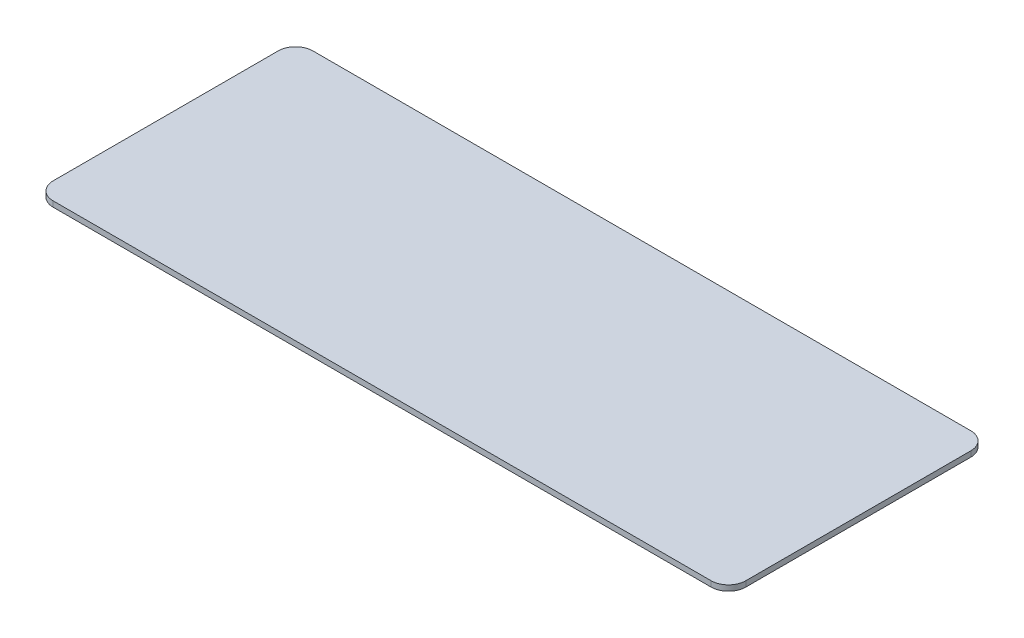
ISO-10303-21;
HEADER;
FILE_DESCRIPTION(('STEP AP214'),'2;1');
FILE_NAME('part.step','',(''),(''),'','','');
FILE_SCHEMA(('AUTOMOTIVE_DESIGN { 1 0 10303 214 1 1 1 1 }'));
ENDSEC;
DATA;
#1=APPLICATION_CONTEXT('core data for automotive mechanical design processes');
#2=APPLICATION_PROTOCOL_DEFINITION('international standard','automotive_design',2000,#1);
#3=PRODUCT_CONTEXT('',#1,'mechanical');
#4=PRODUCT('Part','Part','',(#3));
#5=PRODUCT_RELATED_PRODUCT_CATEGORY('part','',(#4));
#6=PRODUCT_DEFINITION_FORMATION('','',#4);
#7=PRODUCT_DEFINITION_CONTEXT('part definition',#1,'design');
#8=PRODUCT_DEFINITION('design','',#6,#7);
#9=PRODUCT_DEFINITION_SHAPE('','',#8);
#10=(LENGTH_UNIT() NAMED_UNIT(*) SI_UNIT(.MILLI.,.METRE.));
#11=(NAMED_UNIT(*) PLANE_ANGLE_UNIT() SI_UNIT($,.RADIAN.));
#12=(NAMED_UNIT(*) SI_UNIT($,.STERADIAN.) SOLID_ANGLE_UNIT());
#13=UNCERTAINTY_MEASURE_WITH_UNIT(LENGTH_MEASURE(1.E-05),#10,'distance_accuracy_value','');
#14=(GEOMETRIC_REPRESENTATION_CONTEXT(3) GLOBAL_UNCERTAINTY_ASSIGNED_CONTEXT((#13)) GLOBAL_UNIT_ASSIGNED_CONTEXT((#10,
#11,#12)) REPRESENTATION_CONTEXT('',''));
#15=CARTESIAN_POINT('',(0.,0.,0.));
#16=DIRECTION('',(0.,0.,1.));
#17=DIRECTION('',(1.,0.,0.));
#18=AXIS2_PLACEMENT_3D('',#15,#16,#17);
#19=CARTESIAN_POINT('',(100.,1.6,37.5));
#20=DIRECTION('',(-1.,0.,0.));
#21=DIRECTION('',(0.,0.,1.));
#22=AXIS2_PLACEMENT_3D('',#19,#20,#21);
#23=PLANE('',#22);
#24=DIRECTION('',(0.,0.,-1.));
#25=VECTOR('',#24,1.);
#26=CARTESIAN_POINT('',(100.,1.6,37.5));
#27=LINE('',#26,#25);
#28=CARTESIAN_POINT('',(100.,1.6,32.5));
#29=VERTEX_POINT('',#28);
#30=CARTESIAN_POINT('',(100.,1.6,-32.5));
#31=VERTEX_POINT('',#30);
#32=EDGE_CURVE('E127',#29,#31,#27,.T.);
#33=ORIENTED_EDGE('',*,*,#32,.F.);
#34=DIRECTION('',(0.,-1.,0.));
#35=VECTOR('',#34,1.);
#36=CARTESIAN_POINT('',(100.,1.6,32.5));
#37=LINE('',#36,#35);
#38=CARTESIAN_POINT('',(100.,0.,32.5));
#39=VERTEX_POINT('',#38);
#40=EDGE_CURVE('E111',#29,#39,#37,.T.);
#41=ORIENTED_EDGE('',*,*,#40,.T.);
#42=DIRECTION('',(0.,0.,-1.));
#43=VECTOR('',#42,1.);
#44=CARTESIAN_POINT('',(100.,0.,37.5));
#45=LINE('',#44,#43);
#46=CARTESIAN_POINT('',(100.,0.,-32.5));
#47=VERTEX_POINT('',#46);
#48=EDGE_CURVE('E124',#39,#47,#45,.T.);
#49=ORIENTED_EDGE('',*,*,#48,.T.);
#50=DIRECTION('',(0.,-1.,0.));
#51=VECTOR('',#50,1.);
#52=CARTESIAN_POINT('',(100.,1.6,-32.5));
#53=LINE('',#52,#51);
#54=EDGE_CURVE('E130',#47,#31,#53,.F.);
#55=ORIENTED_EDGE('',*,*,#54,.T.);
#56=EDGE_LOOP('',(#33,#41,#49,#55));
#57=FACE_BOUND('',#56,.T.);
#58=ADVANCED_FACE('F40',(#57),#23,.F.);
#59=CARTESIAN_POINT('',(-100.,1.6,-37.5));
#60=DIRECTION('',(0.,0.,1.));
#61=DIRECTION('',(1.,0.,0.));
#62=AXIS2_PLACEMENT_3D('',#59,#60,#61);
#63=PLANE('',#62);
#64=DIRECTION('',(-1.,0.,0.));
#65=VECTOR('',#64,1.);
#66=CARTESIAN_POINT('',(-100.,1.6,-37.5));
#67=LINE('',#66,#65);
#68=CARTESIAN_POINT('',(95.,1.6,-37.5));
#69=VERTEX_POINT('',#68);
#70=CARTESIAN_POINT('',(-95.,1.6,-37.5));
#71=VERTEX_POINT('',#70);
#72=EDGE_CURVE('E187',#69,#71,#67,.T.);
#73=ORIENTED_EDGE('',*,*,#72,.F.);
#74=DIRECTION('',(0.,-1.,0.));
#75=VECTOR('',#74,1.);
#76=CARTESIAN_POINT('',(95.,1.6,-37.5));
#77=LINE('',#76,#75);
#78=CARTESIAN_POINT('',(95.,0.,-37.5));
#79=VERTEX_POINT('',#78);
#80=EDGE_CURVE('E178',#69,#79,#77,.T.);
#81=ORIENTED_EDGE('',*,*,#80,.T.);
#82=DIRECTION('',(-1.,0.,0.));
#83=VECTOR('',#82,1.);
#84=CARTESIAN_POINT('',(-100.,0.,-37.5));
#85=LINE('',#84,#83);
#86=CARTESIAN_POINT('',(-95.,0.,-37.5));
#87=VERTEX_POINT('',#86);
#88=EDGE_CURVE('E135',#79,#87,#85,.T.);
#89=ORIENTED_EDGE('',*,*,#88,.T.);
#90=DIRECTION('',(0.,-1.,0.));
#91=VECTOR('',#90,1.);
#92=CARTESIAN_POINT('',(-95.,1.6,-37.5));
#93=LINE('',#92,#91);
#94=EDGE_CURVE('E175',#87,#71,#93,.F.);
#95=ORIENTED_EDGE('',*,*,#94,.T.);
#96=EDGE_LOOP('',(#73,#81,#89,#95));
#97=FACE_BOUND('',#96,.T.);
#98=ADVANCED_FACE('F198',(#97),#63,.F.);
#99=CARTESIAN_POINT('',(-100.,1.6,37.5));
#100=DIRECTION('',(1.,0.,0.));
#101=DIRECTION('',(0.,0.,-1.));
#102=AXIS2_PLACEMENT_3D('',#99,#100,#101);
#103=PLANE('',#102);
#104=DIRECTION('',(0.,0.,1.));
#105=VECTOR('',#104,1.);
#106=CARTESIAN_POINT('',(-100.,1.6,37.5));
#107=LINE('',#106,#105);
#108=CARTESIAN_POINT('',(-100.,1.6,-32.5));
#109=VERTEX_POINT('',#108);
#110=CARTESIAN_POINT('',(-100.,1.6,32.5));
#111=VERTEX_POINT('',#110);
#112=EDGE_CURVE('E185',#109,#111,#107,.T.);
#113=ORIENTED_EDGE('',*,*,#112,.F.);
#114=DIRECTION('',(0.,-1.,0.));
#115=VECTOR('',#114,1.);
#116=CARTESIAN_POINT('',(-100.,1.6,-32.5));
#117=LINE('',#116,#115);
#118=CARTESIAN_POINT('',(-100.,0.,-32.5));
#119=VERTEX_POINT('',#118);
#120=EDGE_CURVE('E11',#109,#119,#117,.T.);
#121=ORIENTED_EDGE('',*,*,#120,.T.);
#122=DIRECTION('',(0.,0.,1.));
#123=VECTOR('',#122,1.);
#124=CARTESIAN_POINT('',(-100.,0.,37.5));
#125=LINE('',#124,#123);
#126=CARTESIAN_POINT('',(-100.,0.,32.5));
#127=VERTEX_POINT('',#126);
#128=EDGE_CURVE('E139',#119,#127,#125,.T.);
#129=ORIENTED_EDGE('',*,*,#128,.T.);
#130=DIRECTION('',(0.,-1.,0.));
#131=VECTOR('',#130,1.);
#132=CARTESIAN_POINT('',(-100.,1.6,32.5));
#133=LINE('',#132,#131);
#134=EDGE_CURVE('E49',#127,#111,#133,.F.);
#135=ORIENTED_EDGE('',*,*,#134,.T.);
#136=EDGE_LOOP('',(#113,#121,#129,#135));
#137=FACE_BOUND('',#136,.T.);
#138=ADVANCED_FACE('F204',(#137),#103,.F.);
#139=CARTESIAN_POINT('',(-100.,1.6,37.5));
#140=DIRECTION('',(0.,0.,-1.));
#141=DIRECTION('',(-1.,0.,0.));
#142=AXIS2_PLACEMENT_3D('',#139,#140,#141);
#143=PLANE('',#142);
#144=DIRECTION('',(1.,0.,0.));
#145=VECTOR('',#144,1.);
#146=CARTESIAN_POINT('',(-100.,0.,37.5));
#147=LINE('',#146,#145);
#148=CARTESIAN_POINT('',(-95.,0.,37.5));
#149=VERTEX_POINT('',#148);
#150=CARTESIAN_POINT('',(95.,0.,37.5));
#151=VERTEX_POINT('',#150);
#152=EDGE_CURVE('E147',#149,#151,#147,.T.);
#153=ORIENTED_EDGE('',*,*,#152,.T.);
#154=DIRECTION('',(0.,-1.,0.));
#155=VECTOR('',#154,1.);
#156=CARTESIAN_POINT('',(95.,1.6,37.5));
#157=LINE('',#156,#155);
#158=CARTESIAN_POINT('',(95.,1.6,37.5));
#159=VERTEX_POINT('',#158);
#160=EDGE_CURVE('E112',#151,#159,#157,.F.);
#161=ORIENTED_EDGE('',*,*,#160,.T.);
#162=DIRECTION('',(1.,0.,0.));
#163=VECTOR('',#162,1.);
#164=CARTESIAN_POINT('',(-100.,1.6,37.5));
#165=LINE('',#164,#163);
#166=CARTESIAN_POINT('',(-95.,1.6,37.5));
#167=VERTEX_POINT('',#166);
#168=EDGE_CURVE('E142',#167,#159,#165,.T.);
#169=ORIENTED_EDGE('',*,*,#168,.F.);
#170=DIRECTION('',(0.,-1.,0.));
#171=VECTOR('',#170,1.);
#172=CARTESIAN_POINT('',(-95.,1.6,37.5));
#173=LINE('',#172,#171);
#174=EDGE_CURVE('E118',#167,#149,#173,.T.);
#175=ORIENTED_EDGE('',*,*,#174,.T.);
#176=EDGE_LOOP('',(#153,#161,#169,#175));
#177=FACE_BOUND('',#176,.T.);
#178=ADVANCED_FACE('F210',(#177),#143,.F.);
#179=CARTESIAN_POINT('',(0.,1.6,0.));
#180=DIRECTION('',(0.,-1.,0.));
#181=DIRECTION('',(0.,0.,-1.));
#182=AXIS2_PLACEMENT_3D('',#179,#180,#181);
#183=PLANE('',#182);
#184=ORIENTED_EDGE('',*,*,#168,.T.);
#185=CARTESIAN_POINT('',(95.,1.6,32.5));
#186=DIRECTION('',(0.,-1.,0.));
#187=DIRECTION('',(0.,0.,-1.));
#188=AXIS2_PLACEMENT_3D('',#185,#186,#187);
#189=CIRCLE('',#188,5.);
#190=EDGE_CURVE('E172',#159,#29,#189,.F.);
#191=ORIENTED_EDGE('',*,*,#190,.T.);
#192=ORIENTED_EDGE('',*,*,#32,.T.);
#193=CARTESIAN_POINT('',(95.,1.6,-32.5));
#194=DIRECTION('',(0.,-1.,0.));
#195=DIRECTION('',(0.,0.,-1.));
#196=AXIS2_PLACEMENT_3D('',#193,#194,#195);
#197=CIRCLE('',#196,5.);
#198=EDGE_CURVE('E169',#31,#69,#197,.F.);
#199=ORIENTED_EDGE('',*,*,#198,.T.);
#200=ORIENTED_EDGE('',*,*,#72,.T.);
#201=CARTESIAN_POINT('',(-95.,1.6,-32.5));
#202=DIRECTION('',(0.,-1.,0.));
#203=DIRECTION('',(0.,0.,-1.));
#204=AXIS2_PLACEMENT_3D('',#201,#202,#203);
#205=CIRCLE('',#204,5.);
#206=EDGE_CURVE('E62',#71,#109,#205,.F.);
#207=ORIENTED_EDGE('',*,*,#206,.T.);
#208=ORIENTED_EDGE('',*,*,#112,.T.);
#209=CARTESIAN_POINT('',(-95.,1.6,32.5));
#210=DIRECTION('',(0.,-1.,0.));
#211=DIRECTION('',(0.,0.,-1.));
#212=AXIS2_PLACEMENT_3D('',#209,#210,#211);
#213=CIRCLE('',#212,5.);
#214=EDGE_CURVE('E164',#111,#167,#213,.F.);
#215=ORIENTED_EDGE('',*,*,#214,.T.);
#216=EDGE_LOOP('',(#184,#191,#192,#199,#200,#207,#208,#215));
#217=FACE_BOUND('',#216,.T.);
#218=ADVANCED_FACE('F192',(#217),#183,.F.);
#219=CARTESIAN_POINT('',(0.,0.,0.));
#220=DIRECTION('',(0.,-1.,0.));
#221=DIRECTION('',(0.,0.,-1.));
#222=AXIS2_PLACEMENT_3D('',#219,#220,#221);
#223=PLANE('',#222);
#224=ORIENTED_EDGE('',*,*,#48,.F.);
#225=CARTESIAN_POINT('',(95.,0.,32.5));
#226=DIRECTION('',(0.,-1.,0.));
#227=DIRECTION('',(0.,0.,-1.));
#228=AXIS2_PLACEMENT_3D('',#225,#226,#227);
#229=CIRCLE('',#228,5.);
#230=EDGE_CURVE('E107',#39,#151,#229,.T.);
#231=ORIENTED_EDGE('',*,*,#230,.T.);
#232=ORIENTED_EDGE('',*,*,#152,.F.);
#233=CARTESIAN_POINT('',(-95.,0.,32.5));
#234=DIRECTION('',(0.,-1.,0.));
#235=DIRECTION('',(0.,0.,-1.));
#236=AXIS2_PLACEMENT_3D('',#233,#234,#235);
#237=CIRCLE('',#236,5.);
#238=EDGE_CURVE('E129',#149,#127,#237,.T.);
#239=ORIENTED_EDGE('',*,*,#238,.T.);
#240=ORIENTED_EDGE('',*,*,#128,.F.);
#241=CARTESIAN_POINT('',(-95.,0.,-32.5));
#242=DIRECTION('',(0.,-1.,0.));
#243=DIRECTION('',(0.,0.,-1.));
#244=AXIS2_PLACEMENT_3D('',#241,#242,#243);
#245=CIRCLE('',#244,5.);
#246=EDGE_CURVE('E154',#119,#87,#245,.T.);
#247=ORIENTED_EDGE('',*,*,#246,.T.);
#248=ORIENTED_EDGE('',*,*,#88,.F.);
#249=CARTESIAN_POINT('',(95.,0.,-32.5));
#250=DIRECTION('',(0.,-1.,0.));
#251=DIRECTION('',(0.,0.,-1.));
#252=AXIS2_PLACEMENT_3D('',#249,#250,#251);
#253=CIRCLE('',#252,5.);
#254=EDGE_CURVE('E119',#79,#47,#253,.T.);
#255=ORIENTED_EDGE('',*,*,#254,.T.);
#256=EDGE_LOOP('',(#224,#231,#232,#239,#240,#247,#248,#255));
#257=FACE_BOUND('',#256,.T.);
#258=ADVANCED_FACE('F132',(#257),#223,.T.);
#259=CARTESIAN_POINT('',(95.,1.6,32.5));
#260=DIRECTION('',(0.,-1.,0.));
#261=DIRECTION('',(0.,0.,-1.));
#262=AXIS2_PLACEMENT_3D('',#259,#260,#261);
#263=CYLINDRICAL_SURFACE('',#262,5.);
#264=ORIENTED_EDGE('',*,*,#190,.F.);
#265=ORIENTED_EDGE('',*,*,#160,.F.);
#266=ORIENTED_EDGE('',*,*,#230,.F.);
#267=ORIENTED_EDGE('',*,*,#40,.F.);
#268=EDGE_LOOP('',(#264,#265,#266,#267));
#269=FACE_BOUND('',#268,.T.);
#270=ADVANCED_FACE('F110',(#269),#263,.T.);
#271=CARTESIAN_POINT('',(95.,1.6,-32.5));
#272=DIRECTION('',(0.,-1.,0.));
#273=DIRECTION('',(0.,0.,-1.));
#274=AXIS2_PLACEMENT_3D('',#271,#272,#273);
#275=CYLINDRICAL_SURFACE('',#274,5.);
#276=ORIENTED_EDGE('',*,*,#198,.F.);
#277=ORIENTED_EDGE('',*,*,#54,.F.);
#278=ORIENTED_EDGE('',*,*,#254,.F.);
#279=ORIENTED_EDGE('',*,*,#80,.F.);
#280=EDGE_LOOP('',(#276,#277,#278,#279));
#281=FACE_BOUND('',#280,.T.);
#282=ADVANCED_FACE('F196',(#281),#275,.T.);
#283=CARTESIAN_POINT('',(-95.,1.6,-32.5));
#284=DIRECTION('',(0.,-1.,0.));
#285=DIRECTION('',(0.,0.,-1.));
#286=AXIS2_PLACEMENT_3D('',#283,#284,#285);
#287=CYLINDRICAL_SURFACE('',#286,5.);
#288=ORIENTED_EDGE('',*,*,#206,.F.);
#289=ORIENTED_EDGE('',*,*,#94,.F.);
#290=ORIENTED_EDGE('',*,*,#246,.F.);
#291=ORIENTED_EDGE('',*,*,#120,.F.);
#292=EDGE_LOOP('',(#288,#289,#290,#291));
#293=FACE_BOUND('',#292,.T.);
#294=ADVANCED_FACE('F203',(#293),#287,.T.);
#295=CARTESIAN_POINT('',(-95.,1.6,32.5));
#296=DIRECTION('',(0.,-1.,0.));
#297=DIRECTION('',(0.,0.,-1.));
#298=AXIS2_PLACEMENT_3D('',#295,#296,#297);
#299=CYLINDRICAL_SURFACE('',#298,5.);
#300=ORIENTED_EDGE('',*,*,#214,.F.);
#301=ORIENTED_EDGE('',*,*,#134,.F.);
#302=ORIENTED_EDGE('',*,*,#238,.F.);
#303=ORIENTED_EDGE('',*,*,#174,.F.);
#304=EDGE_LOOP('',(#300,#301,#302,#303));
#305=FACE_BOUND('',#304,.T.);
#306=ADVANCED_FACE('F42',(#305),#299,.T.);
#307=CLOSED_SHELL('',(#58,#98,#138,#178,#218,#258,#270,#282,#294,#306));
#308=MANIFOLD_SOLID_BREP('B2',#307);
#309=ADVANCED_BREP_SHAPE_REPRESENTATION('',(#18,#308),#14);
#310=SHAPE_DEFINITION_REPRESENTATION(#9,#309);
ENDSEC;
END-ISO-10303-21;
